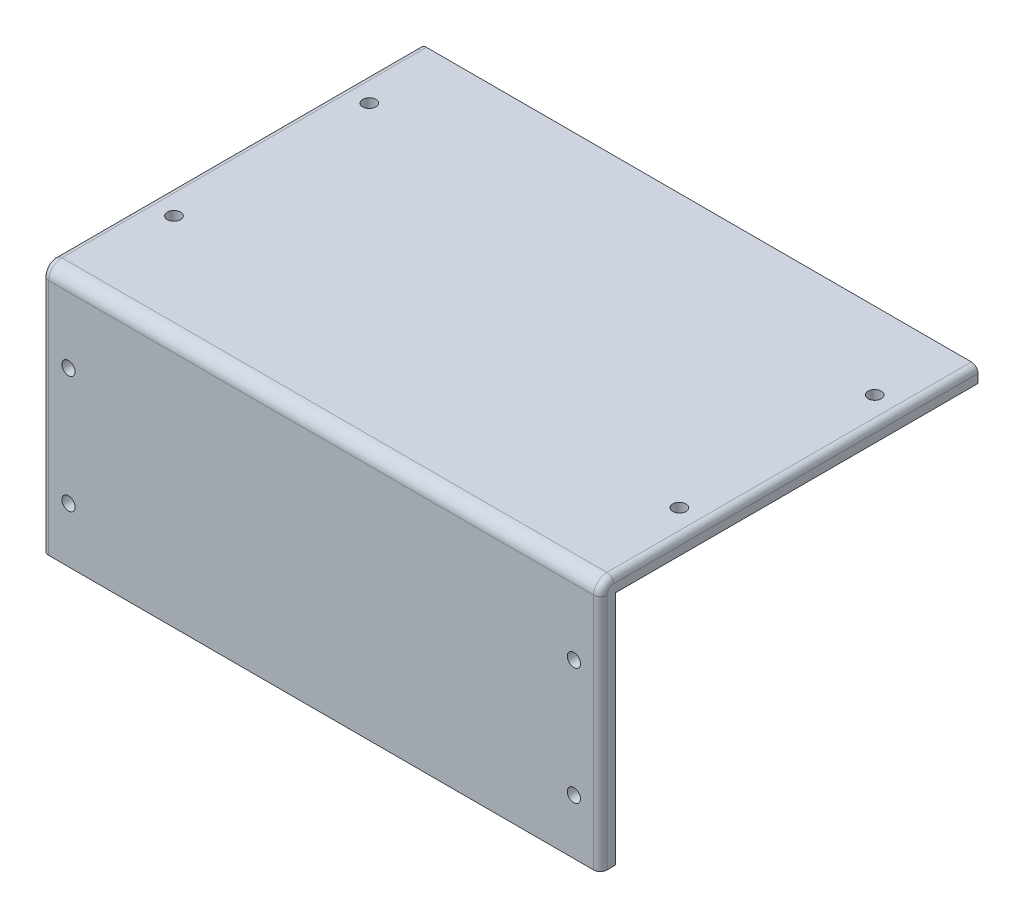
ISO-10303-21;
HEADER;
FILE_DESCRIPTION(('STEP AP214'),'2;1');
FILE_NAME('part.step','',(''),(''),'','','');
FILE_SCHEMA(('AUTOMOTIVE_DESIGN { 1 0 10303 214 1 1 1 1 }'));
ENDSEC;
DATA;
#1=APPLICATION_CONTEXT('core data for automotive mechanical design processes');
#2=APPLICATION_PROTOCOL_DEFINITION('international standard','automotive_design',2000,#1);
#3=PRODUCT_CONTEXT('',#1,'mechanical');
#4=PRODUCT('Part','Part','',(#3));
#5=PRODUCT_RELATED_PRODUCT_CATEGORY('part','',(#4));
#6=PRODUCT_DEFINITION_FORMATION('','',#4);
#7=PRODUCT_DEFINITION_CONTEXT('part definition',#1,'design');
#8=PRODUCT_DEFINITION('design','',#6,#7);
#9=PRODUCT_DEFINITION_SHAPE('','',#8);
#10=(LENGTH_UNIT() NAMED_UNIT(*) SI_UNIT(.MILLI.,.METRE.));
#11=(NAMED_UNIT(*) PLANE_ANGLE_UNIT() SI_UNIT($,.RADIAN.));
#12=(NAMED_UNIT(*) SI_UNIT($,.STERADIAN.) SOLID_ANGLE_UNIT());
#13=UNCERTAINTY_MEASURE_WITH_UNIT(LENGTH_MEASURE(1.E-05),#10,'distance_accuracy_value','');
#14=(GEOMETRIC_REPRESENTATION_CONTEXT(3) GLOBAL_UNCERTAINTY_ASSIGNED_CONTEXT((#13)) GLOBAL_UNIT_ASSIGNED_CONTEXT((#10,
#11,#12)) REPRESENTATION_CONTEXT('',''));
#15=CARTESIAN_POINT('',(0.,0.,0.));
#16=DIRECTION('',(0.,0.,1.));
#17=DIRECTION('',(1.,0.,0.));
#18=AXIS2_PLACEMENT_3D('',#15,#16,#17);
#19=CARTESIAN_POINT('',(0.,0.,3.5));
#20=DIRECTION('',(1.,0.,0.));
#21=DIRECTION('',(0.,0.,-1.));
#22=AXIS2_PLACEMENT_3D('',#19,#20,#21);
#23=PLANE('',#22);
#24=CARTESIAN_POINT('',(0.,54.15,0.5));
#25=DIRECTION('',(1.,0.,0.));
#26=DIRECTION('',(0.,0.,-1.));
#27=AXIS2_PLACEMENT_3D('',#24,#25,#26);
#28=CIRCLE('',#27,1.5);
#29=CARTESIAN_POINT('',(0.,54.15,2.));
#30=VERTEX_POINT('',#29);
#31=CARTESIAN_POINT('',(0.,55.65,0.499999999999979));
#32=VERTEX_POINT('',#31);
#33=EDGE_CURVE('E199',#30,#32,#28,.F.);
#34=ORIENTED_EDGE('',*,*,#33,.T.);
#35=DIRECTION('',(0.,0.,-1.));
#36=VECTOR('',#35,1.);
#37=CARTESIAN_POINT('',(0.,55.65,-82.44));
#38=LINE('',#37,#36);
#39=CARTESIAN_POINT('',(0.,55.65,-82.44));
#40=VERTEX_POINT('',#39);
#41=EDGE_CURVE('E201',#32,#40,#38,.T.);
#42=ORIENTED_EDGE('',*,*,#41,.T.);
#43=DIRECTION('',(0.,-1.,0.));
#44=VECTOR('',#43,1.);
#45=CARTESIAN_POINT('',(0.,57.15,-82.44));
#46=LINE('',#45,#44);
#47=CARTESIAN_POINT('',(0.,53.65,-82.44));
#48=VERTEX_POINT('',#47);
#49=EDGE_CURVE('E365',#40,#48,#46,.T.);
#50=ORIENTED_EDGE('',*,*,#49,.T.);
#51=DIRECTION('',(0.,0.,1.));
#52=VECTOR('',#51,1.);
#53=CARTESIAN_POINT('',(0.,53.65,-82.44));
#54=LINE('',#53,#52);
#55=CARTESIAN_POINT('',(0.,53.65,0.));
#56=VERTEX_POINT('',#55);
#57=EDGE_CURVE('E144',#48,#56,#54,.T.);
#58=ORIENTED_EDGE('',*,*,#57,.T.);
#59=DIRECTION('',(0.,-1.,0.));
#60=VECTOR('',#59,1.);
#61=CARTESIAN_POINT('',(0.,0.,0.));
#62=LINE('',#61,#60);
#63=CARTESIAN_POINT('',(0.,0.,0.));
#64=VERTEX_POINT('',#63);
#65=EDGE_CURVE('E148',#56,#64,#62,.T.);
#66=ORIENTED_EDGE('',*,*,#65,.T.);
#67=DIRECTION('',(0.,0.,-1.));
#68=VECTOR('',#67,1.);
#69=CARTESIAN_POINT('',(0.,0.,3.5));
#70=LINE('',#69,#68);
#71=CARTESIAN_POINT('',(0.,0.,2.));
#72=VERTEX_POINT('',#71);
#73=EDGE_CURVE('E171',#72,#64,#70,.T.);
#74=ORIENTED_EDGE('',*,*,#73,.F.);
#75=DIRECTION('',(0.,-1.,0.));
#76=VECTOR('',#75,1.);
#77=CARTESIAN_POINT('',(0.,0.,2.));
#78=LINE('',#77,#76);
#79=EDGE_CURVE('E190',#72,#30,#78,.F.);
#80=ORIENTED_EDGE('',*,*,#79,.T.);
#81=EDGE_LOOP('',(#34,#42,#50,#58,#66,#74,#80));
#82=FACE_BOUND('',#81,.T.);
#83=ADVANCED_FACE('F38',(#82),#23,.F.);
#84=CARTESIAN_POINT('',(0.,0.,3.5));
#85=DIRECTION('',(0.,1.,0.));
#86=DIRECTION('',(0.,0.,1.));
#87=AXIS2_PLACEMENT_3D('',#84,#85,#86);
#88=PLANE('',#87);
#89=DIRECTION('',(1.,0.,0.));
#90=VECTOR('',#89,1.);
#91=CARTESIAN_POINT('',(0.,0.,3.5));
#92=LINE('',#91,#90);
#93=CARTESIAN_POINT('',(1.5,0.,3.5));
#94=VERTEX_POINT('',#93);
#95=CARTESIAN_POINT('',(125.5,0.,3.5));
#96=VERTEX_POINT('',#95);
#97=EDGE_CURVE('E162',#94,#96,#92,.T.);
#98=ORIENTED_EDGE('',*,*,#97,.F.);
#99=CARTESIAN_POINT('',(1.5,0.,2.));
#100=DIRECTION('',(0.,1.,0.));
#101=DIRECTION('',(0.,0.,1.));
#102=AXIS2_PLACEMENT_3D('',#99,#100,#101);
#103=CIRCLE('',#102,1.5);
#104=EDGE_CURVE('E11',#94,#72,#103,.F.);
#105=ORIENTED_EDGE('',*,*,#104,.T.);
#106=ORIENTED_EDGE('',*,*,#73,.T.);
#107=DIRECTION('',(1.,0.,0.));
#108=VECTOR('',#107,1.);
#109=CARTESIAN_POINT('',(0.,0.,0.));
#110=LINE('',#109,#108);
#111=CARTESIAN_POINT('',(127.,0.,0.));
#112=VERTEX_POINT('',#111);
#113=EDGE_CURVE('E152',#64,#112,#110,.T.);
#114=ORIENTED_EDGE('',*,*,#113,.T.);
#115=DIRECTION('',(0.,0.,-1.));
#116=VECTOR('',#115,1.);
#117=CARTESIAN_POINT('',(127.,0.,3.5));
#118=LINE('',#117,#116);
#119=CARTESIAN_POINT('',(127.,0.,2.));
#120=VERTEX_POINT('',#119);
#121=EDGE_CURVE('E163',#120,#112,#118,.T.);
#122=ORIENTED_EDGE('',*,*,#121,.F.);
#123=CARTESIAN_POINT('',(125.5,0.,2.));
#124=DIRECTION('',(0.,1.,0.));
#125=DIRECTION('',(0.,0.,1.));
#126=AXIS2_PLACEMENT_3D('',#123,#124,#125);
#127=CIRCLE('',#126,1.5);
#128=EDGE_CURVE('E187',#120,#96,#127,.F.);
#129=ORIENTED_EDGE('',*,*,#128,.T.);
#130=EDGE_LOOP('',(#98,#105,#106,#114,#122,#129));
#131=FACE_BOUND('',#130,.T.);
#132=ADVANCED_FACE('F225',(#131),#88,.F.);
#133=CARTESIAN_POINT('',(127.,0.,3.5));
#134=DIRECTION('',(-1.,0.,0.));
#135=DIRECTION('',(0.,0.,1.));
#136=AXIS2_PLACEMENT_3D('',#133,#134,#135);
#137=PLANE('',#136);
#138=DIRECTION('',(0.,-1.,0.));
#139=VECTOR('',#138,1.);
#140=CARTESIAN_POINT('',(127.,57.15,-82.44));
#141=LINE('',#140,#139);
#142=CARTESIAN_POINT('',(127.,55.65,-82.44));
#143=VERTEX_POINT('',#142);
#144=CARTESIAN_POINT('',(127.,53.65,-82.44));
#145=VERTEX_POINT('',#144);
#146=EDGE_CURVE('E123',#143,#145,#141,.T.);
#147=ORIENTED_EDGE('',*,*,#146,.F.);
#148=DIRECTION('',(0.,0.,-1.));
#149=VECTOR('',#148,1.);
#150=CARTESIAN_POINT('',(127.,55.65,0.499999999999979));
#151=LINE('',#150,#149);
#152=CARTESIAN_POINT('',(127.,55.65,0.499999999999979));
#153=VERTEX_POINT('',#152);
#154=EDGE_CURVE('E181',#143,#153,#151,.F.);
#155=ORIENTED_EDGE('',*,*,#154,.T.);
#156=CARTESIAN_POINT('',(127.,54.15,0.5));
#157=DIRECTION('',(-1.,0.,0.));
#158=DIRECTION('',(0.,0.,1.));
#159=AXIS2_PLACEMENT_3D('',#156,#157,#158);
#160=CIRCLE('',#159,1.5);
#161=CARTESIAN_POINT('',(127.,54.15,2.));
#162=VERTEX_POINT('',#161);
#163=EDGE_CURVE('E179',#153,#162,#160,.F.);
#164=ORIENTED_EDGE('',*,*,#163,.T.);
#165=DIRECTION('',(0.,1.,0.));
#166=VECTOR('',#165,1.);
#167=CARTESIAN_POINT('',(127.,0.,2.));
#168=LINE('',#167,#166);
#169=EDGE_CURVE('E177',#162,#120,#168,.F.);
#170=ORIENTED_EDGE('',*,*,#169,.T.);
#171=ORIENTED_EDGE('',*,*,#121,.T.);
#172=DIRECTION('',(0.,1.,0.));
#173=VECTOR('',#172,1.);
#174=CARTESIAN_POINT('',(127.,0.,0.));
#175=LINE('',#174,#173);
#176=CARTESIAN_POINT('',(127.,53.65,0.));
#177=VERTEX_POINT('',#176);
#178=EDGE_CURVE('E140',#112,#177,#175,.T.);
#179=ORIENTED_EDGE('',*,*,#178,.T.);
#180=DIRECTION('',(0.,0.,1.));
#181=VECTOR('',#180,1.);
#182=CARTESIAN_POINT('',(127.,53.65,0.));
#183=LINE('',#182,#181);
#184=EDGE_CURVE('E135',#145,#177,#183,.T.);
#185=ORIENTED_EDGE('',*,*,#184,.F.);
#186=EDGE_LOOP('',(#147,#155,#164,#170,#171,#179,#185));
#187=FACE_BOUND('',#186,.T.);
#188=ADVANCED_FACE('F138',(#187),#137,.F.);
#189=CARTESIAN_POINT('',(0.,0.,3.5));
#190=DIRECTION('',(0.,0.,-1.));
#191=DIRECTION('',(-1.,0.,0.));
#192=AXIS2_PLACEMENT_3D('',#189,#190,#191);
#193=PLANE('',#192);
#194=CARTESIAN_POINT('',(6.00000000000001,39.15,3.5));
#195=DIRECTION('',(0.,0.,-1.));
#196=DIRECTION('',(1.,0.,0.));
#197=AXIS2_PLACEMENT_3D('',#194,#195,#196);
#198=CIRCLE('',#197,1.5);
#199=CARTESIAN_POINT('',(7.5,39.15,3.5));
#200=VERTEX_POINT('',#199);
#201=EDGE_CURVE('E357',#200,#200,#198,.T.);
#202=ORIENTED_EDGE('',*,*,#201,.T.);
#203=EDGE_LOOP('',(#202));
#204=FACE_BOUND('',#203,.T.);
#205=CARTESIAN_POINT('',(6.00000000000001,12.5,3.5));
#206=DIRECTION('',(0.,0.,-1.));
#207=DIRECTION('',(1.,0.,0.));
#208=AXIS2_PLACEMENT_3D('',#205,#206,#207);
#209=CIRCLE('',#208,1.5);
#210=CARTESIAN_POINT('',(7.5,12.5,3.5));
#211=VERTEX_POINT('',#210);
#212=EDGE_CURVE('E351',#211,#211,#209,.T.);
#213=ORIENTED_EDGE('',*,*,#212,.T.);
#214=EDGE_LOOP('',(#213));
#215=FACE_BOUND('',#214,.T.);
#216=CARTESIAN_POINT('',(121.,12.5,3.5));
#217=DIRECTION('',(0.,0.,-1.));
#218=DIRECTION('',(-1.,0.,0.));
#219=AXIS2_PLACEMENT_3D('',#216,#217,#218);
#220=CIRCLE('',#219,1.5);
#221=CARTESIAN_POINT('',(119.5,12.5,3.5));
#222=VERTEX_POINT('',#221);
#223=EDGE_CURVE('E344',#222,#222,#220,.T.);
#224=ORIENTED_EDGE('',*,*,#223,.T.);
#225=EDGE_LOOP('',(#224));
#226=FACE_BOUND('',#225,.T.);
#227=CARTESIAN_POINT('',(121.,39.15,3.5));
#228=DIRECTION('',(0.,0.,-1.));
#229=DIRECTION('',(-1.,0.,0.));
#230=AXIS2_PLACEMENT_3D('',#227,#228,#229);
#231=CIRCLE('',#230,1.5);
#232=CARTESIAN_POINT('',(119.5,39.15,3.5));
#233=VERTEX_POINT('',#232);
#234=EDGE_CURVE('E362',#233,#233,#231,.T.);
#235=ORIENTED_EDGE('',*,*,#234,.T.);
#236=EDGE_LOOP('',(#235));
#237=FACE_BOUND('',#236,.T.);
#238=DIRECTION('',(-1.,0.,0.));
#239=VECTOR('',#238,1.);
#240=CARTESIAN_POINT('',(127.,54.15,3.5));
#241=LINE('',#240,#239);
#242=CARTESIAN_POINT('',(125.5,54.15,3.5));
#243=VERTEX_POINT('',#242);
#244=CARTESIAN_POINT('',(1.5,54.15,3.5));
#245=VERTEX_POINT('',#244);
#246=EDGE_CURVE('E134',#243,#245,#241,.T.);
#247=ORIENTED_EDGE('',*,*,#246,.T.);
#248=DIRECTION('',(0.,-1.,0.));
#249=VECTOR('',#248,1.);
#250=CARTESIAN_POINT('',(1.5,0.,3.5));
#251=LINE('',#250,#249);
#252=EDGE_CURVE('E47',#245,#94,#251,.T.);
#253=ORIENTED_EDGE('',*,*,#252,.T.);
#254=ORIENTED_EDGE('',*,*,#97,.T.);
#255=DIRECTION('',(0.,1.,0.));
#256=VECTOR('',#255,1.);
#257=CARTESIAN_POINT('',(125.5,0.,3.5));
#258=LINE('',#257,#256);
#259=EDGE_CURVE('E185',#96,#243,#258,.T.);
#260=ORIENTED_EDGE('',*,*,#259,.T.);
#261=EDGE_LOOP('',(#247,#253,#254,#260));
#262=FACE_BOUND('',#261,.T.);
#263=ADVANCED_FACE('F238',(#204,#215,#226,#237,#262),#193,.F.);
#264=CARTESIAN_POINT('',(0.,0.,0.));
#265=DIRECTION('',(0.,0.,-1.));
#266=DIRECTION('',(-1.,0.,0.));
#267=AXIS2_PLACEMENT_3D('',#264,#265,#266);
#268=PLANE('',#267);
#269=CARTESIAN_POINT('',(6.00000000000001,39.15,0.));
#270=DIRECTION('',(0.,0.,-1.));
#271=DIRECTION('',(1.,0.,0.));
#272=AXIS2_PLACEMENT_3D('',#269,#270,#271);
#273=CIRCLE('',#272,1.5);
#274=CARTESIAN_POINT('',(7.5,39.15,0.));
#275=VERTEX_POINT('',#274);
#276=EDGE_CURVE('E341',#275,#275,#273,.T.);
#277=ORIENTED_EDGE('',*,*,#276,.F.);
#278=EDGE_LOOP('',(#277));
#279=FACE_BOUND('',#278,.T.);
#280=CARTESIAN_POINT('',(6.00000000000001,12.5,0.));
#281=DIRECTION('',(0.,0.,-1.));
#282=DIRECTION('',(1.,0.,0.));
#283=AXIS2_PLACEMENT_3D('',#280,#281,#282);
#284=CIRCLE('',#283,1.5);
#285=CARTESIAN_POINT('',(7.5,12.5,0.));
#286=VERTEX_POINT('',#285);
#287=EDGE_CURVE('E354',#286,#286,#284,.T.);
#288=ORIENTED_EDGE('',*,*,#287,.F.);
#289=EDGE_LOOP('',(#288));
#290=FACE_BOUND('',#289,.T.);
#291=CARTESIAN_POINT('',(121.,12.5,0.));
#292=DIRECTION('',(0.,0.,-1.));
#293=DIRECTION('',(-1.,0.,0.));
#294=AXIS2_PLACEMENT_3D('',#291,#292,#293);
#295=CIRCLE('',#294,1.5);
#296=CARTESIAN_POINT('',(119.5,12.5,0.));
#297=VERTEX_POINT('',#296);
#298=EDGE_CURVE('E348',#297,#297,#295,.T.);
#299=ORIENTED_EDGE('',*,*,#298,.F.);
#300=EDGE_LOOP('',(#299));
#301=FACE_BOUND('',#300,.T.);
#302=CARTESIAN_POINT('',(121.,39.15,0.));
#303=DIRECTION('',(0.,0.,-1.));
#304=DIRECTION('',(-1.,0.,0.));
#305=AXIS2_PLACEMENT_3D('',#302,#303,#304);
#306=CIRCLE('',#305,1.5);
#307=CARTESIAN_POINT('',(119.5,39.15,0.));
#308=VERTEX_POINT('',#307);
#309=EDGE_CURVE('E347',#308,#308,#306,.T.);
#310=ORIENTED_EDGE('',*,*,#309,.F.);
#311=EDGE_LOOP('',(#310));
#312=FACE_BOUND('',#311,.T.);
#313=ORIENTED_EDGE('',*,*,#65,.F.);
#314=DIRECTION('',(-1.,0.,0.));
#315=VECTOR('',#314,1.);
#316=CARTESIAN_POINT('',(0.,53.65,0.));
#317=LINE('',#316,#315);
#318=EDGE_CURVE('E164',#177,#56,#317,.T.);
#319=ORIENTED_EDGE('',*,*,#318,.F.);
#320=ORIENTED_EDGE('',*,*,#178,.F.);
#321=ORIENTED_EDGE('',*,*,#113,.F.);
#322=EDGE_LOOP('',(#313,#319,#320,#321));
#323=FACE_BOUND('',#322,.T.);
#324=ADVANCED_FACE('F229',(#279,#290,#301,#312,#323),#268,.T.);
#325=CARTESIAN_POINT('',(127.,53.65,-82.44));
#326=DIRECTION('',(0.,-1.,0.));
#327=DIRECTION('',(0.,0.,-1.));
#328=AXIS2_PLACEMENT_3D('',#325,#326,#327);
#329=PLANE('',#328);
#330=CARTESIAN_POINT('',(121.,53.65,-20.5));
#331=DIRECTION('',(0.,-1.,0.));
#332=DIRECTION('',(0.,0.,1.));
#333=AXIS2_PLACEMENT_3D('',#330,#331,#332);
#334=CIRCLE('',#333,1.50000000000001);
#335=CARTESIAN_POINT('',(121.,53.65,-19.));
#336=VERTEX_POINT('',#335);
#337=EDGE_CURVE('E197',#336,#336,#334,.T.);
#338=ORIENTED_EDGE('',*,*,#337,.F.);
#339=EDGE_LOOP('',(#338));
#340=FACE_BOUND('',#339,.T.);
#341=CARTESIAN_POINT('',(121.,53.65,-64.94));
#342=DIRECTION('',(0.,-1.,0.));
#343=DIRECTION('',(0.,0.,1.));
#344=AXIS2_PLACEMENT_3D('',#341,#342,#343);
#345=CIRCLE('',#344,1.50000000000001);
#346=CARTESIAN_POINT('',(121.,53.65,-63.44));
#347=VERTEX_POINT('',#346);
#348=EDGE_CURVE('E328',#347,#347,#345,.T.);
#349=ORIENTED_EDGE('',*,*,#348,.F.);
#350=EDGE_LOOP('',(#349));
#351=FACE_BOUND('',#350,.T.);
#352=CARTESIAN_POINT('',(6.00000000000001,53.65,-64.94));
#353=DIRECTION('',(0.,-1.,0.));
#354=DIRECTION('',(0.,0.,-1.));
#355=AXIS2_PLACEMENT_3D('',#352,#353,#354);
#356=CIRCLE('',#355,1.5);
#357=CARTESIAN_POINT('',(6.00000000000001,53.65,-66.44));
#358=VERTEX_POINT('',#357);
#359=EDGE_CURVE('E321',#358,#358,#356,.T.);
#360=ORIENTED_EDGE('',*,*,#359,.F.);
#361=EDGE_LOOP('',(#360));
#362=FACE_BOUND('',#361,.T.);
#363=CARTESIAN_POINT('',(6.,53.65,-20.5));
#364=DIRECTION('',(0.,-1.,0.));
#365=DIRECTION('',(0.,0.,-1.));
#366=AXIS2_PLACEMENT_3D('',#363,#364,#365);
#367=CIRCLE('',#366,1.5);
#368=CARTESIAN_POINT('',(6.,53.65,-22.));
#369=VERTEX_POINT('',#368);
#370=EDGE_CURVE('E325',#369,#369,#367,.T.);
#371=ORIENTED_EDGE('',*,*,#370,.F.);
#372=EDGE_LOOP('',(#371));
#373=FACE_BOUND('',#372,.T.);
#374=ORIENTED_EDGE('',*,*,#184,.T.);
#375=ORIENTED_EDGE('',*,*,#318,.T.);
#376=ORIENTED_EDGE('',*,*,#57,.F.);
#377=DIRECTION('',(-1.,0.,0.));
#378=VECTOR('',#377,1.);
#379=CARTESIAN_POINT('',(127.,53.65,-82.44));
#380=LINE('',#379,#378);
#381=EDGE_CURVE('E128',#145,#48,#380,.T.);
#382=ORIENTED_EDGE('',*,*,#381,.F.);
#383=EDGE_LOOP('',(#374,#375,#376,#382));
#384=FACE_BOUND('',#383,.T.);
#385=ADVANCED_FACE('F146',(#340,#351,#362,#373,#384),#329,.T.);
#386=CARTESIAN_POINT('',(127.,57.15,-82.44));
#387=DIRECTION('',(0.,0.,-1.));
#388=DIRECTION('',(0.,1.,0.));
#389=AXIS2_PLACEMENT_3D('',#386,#387,#388);
#390=PLANE('',#389);
#391=ORIENTED_EDGE('',*,*,#49,.F.);
#392=CARTESIAN_POINT('',(1.5,55.65,-82.44));
#393=DIRECTION('',(0.,0.,-1.));
#394=DIRECTION('',(0.,1.,0.));
#395=AXIS2_PLACEMENT_3D('',#392,#393,#394);
#396=CIRCLE('',#395,1.5);
#397=CARTESIAN_POINT('',(1.5,57.15,-82.44));
#398=VERTEX_POINT('',#397);
#399=EDGE_CURVE('E204',#40,#398,#396,.T.);
#400=ORIENTED_EDGE('',*,*,#399,.T.);
#401=DIRECTION('',(-1.,0.,0.));
#402=VECTOR('',#401,1.);
#403=CARTESIAN_POINT('',(127.,57.15,-82.44));
#404=LINE('',#403,#402);
#405=CARTESIAN_POINT('',(125.5,57.15,-82.44));
#406=VERTEX_POINT('',#405);
#407=EDGE_CURVE('E149',#406,#398,#404,.T.);
#408=ORIENTED_EDGE('',*,*,#407,.F.);
#409=CARTESIAN_POINT('',(125.5,55.65,-82.44));
#410=DIRECTION('',(0.,0.,-1.));
#411=DIRECTION('',(0.,1.,0.));
#412=AXIS2_PLACEMENT_3D('',#409,#410,#411);
#413=CIRCLE('',#412,1.5);
#414=EDGE_CURVE('E131',#406,#143,#413,.T.);
#415=ORIENTED_EDGE('',*,*,#414,.T.);
#416=ORIENTED_EDGE('',*,*,#146,.T.);
#417=ORIENTED_EDGE('',*,*,#381,.T.);
#418=EDGE_LOOP('',(#391,#400,#408,#415,#416,#417));
#419=FACE_BOUND('',#418,.T.);
#420=ADVANCED_FACE('F126',(#419),#390,.T.);
#421=CARTESIAN_POINT('',(127.,57.15,0.499999999999979));
#422=DIRECTION('',(0.,1.,0.));
#423=DIRECTION('',(0.,0.,1.));
#424=AXIS2_PLACEMENT_3D('',#421,#422,#423);
#425=PLANE('',#424);
#426=CARTESIAN_POINT('',(121.,57.15,-20.5));
#427=DIRECTION('',(0.,-1.,0.));
#428=DIRECTION('',(0.,0.,1.));
#429=AXIS2_PLACEMENT_3D('',#426,#427,#428);
#430=CIRCLE('',#429,1.50000000000001);
#431=CARTESIAN_POINT('',(121.,57.15,-19.));
#432=VERTEX_POINT('',#431);
#433=EDGE_CURVE('E333',#432,#432,#430,.T.);
#434=ORIENTED_EDGE('',*,*,#433,.T.);
#435=EDGE_LOOP('',(#434));
#436=FACE_BOUND('',#435,.T.);
#437=CARTESIAN_POINT('',(121.,57.15,-64.94));
#438=DIRECTION('',(0.,-1.,0.));
#439=DIRECTION('',(0.,0.,1.));
#440=AXIS2_PLACEMENT_3D('',#437,#438,#439);
#441=CIRCLE('',#440,1.50000000000001);
#442=CARTESIAN_POINT('',(121.,57.15,-63.44));
#443=VERTEX_POINT('',#442);
#444=EDGE_CURVE('E323',#443,#443,#441,.T.);
#445=ORIENTED_EDGE('',*,*,#444,.T.);
#446=EDGE_LOOP('',(#445));
#447=FACE_BOUND('',#446,.T.);
#448=CARTESIAN_POINT('',(6.00000000000001,57.15,-64.94));
#449=DIRECTION('',(0.,-1.,0.));
#450=DIRECTION('',(0.,0.,-1.));
#451=AXIS2_PLACEMENT_3D('',#448,#449,#450);
#452=CIRCLE('',#451,1.5);
#453=CARTESIAN_POINT('',(6.00000000000001,57.15,-66.44));
#454=VERTEX_POINT('',#453);
#455=EDGE_CURVE('E318',#454,#454,#452,.T.);
#456=ORIENTED_EDGE('',*,*,#455,.T.);
#457=EDGE_LOOP('',(#456));
#458=FACE_BOUND('',#457,.T.);
#459=CARTESIAN_POINT('',(6.,57.15,-20.5));
#460=DIRECTION('',(0.,-1.,0.));
#461=DIRECTION('',(0.,0.,-1.));
#462=AXIS2_PLACEMENT_3D('',#459,#460,#461);
#463=CIRCLE('',#462,1.5);
#464=CARTESIAN_POINT('',(6.,57.15,-22.));
#465=VERTEX_POINT('',#464);
#466=EDGE_CURVE('E338',#465,#465,#463,.T.);
#467=ORIENTED_EDGE('',*,*,#466,.T.);
#468=EDGE_LOOP('',(#467));
#469=FACE_BOUND('',#468,.T.);
#470=ORIENTED_EDGE('',*,*,#407,.T.);
#471=DIRECTION('',(0.,0.,-1.));
#472=VECTOR('',#471,1.);
#473=CARTESIAN_POINT('',(1.5,57.15,0.499999999999979));
#474=LINE('',#473,#472);
#475=CARTESIAN_POINT('',(1.5,57.15,0.499999999999979));
#476=VERTEX_POINT('',#475);
#477=EDGE_CURVE('E206',#398,#476,#474,.F.);
#478=ORIENTED_EDGE('',*,*,#477,.T.);
#479=DIRECTION('',(-1.,0.,0.));
#480=VECTOR('',#479,1.);
#481=CARTESIAN_POINT('',(127.,57.15,0.499999999999979));
#482=LINE('',#481,#480);
#483=CARTESIAN_POINT('',(125.5,57.15,0.499999999999979));
#484=VERTEX_POINT('',#483);
#485=EDGE_CURVE('E155',#484,#476,#482,.T.);
#486=ORIENTED_EDGE('',*,*,#485,.F.);
#487=DIRECTION('',(0.,0.,-1.));
#488=VECTOR('',#487,1.);
#489=CARTESIAN_POINT('',(125.5,57.15,-82.44));
#490=LINE('',#489,#488);
#491=EDGE_CURVE('E173',#484,#406,#490,.T.);
#492=ORIENTED_EDGE('',*,*,#491,.T.);
#493=EDGE_LOOP('',(#470,#478,#486,#492));
#494=FACE_BOUND('',#493,.T.);
#495=ADVANCED_FACE('F244',(#436,#447,#458,#469,#494),#425,.T.);
#496=CARTESIAN_POINT('',(127.,54.15,0.5));
#497=DIRECTION('',(-1.,0.,0.));
#498=DIRECTION('',(0.,0.,1.));
#499=AXIS2_PLACEMENT_3D('',#496,#497,#498);
#500=CYLINDRICAL_SURFACE('',#499,3.);
#501=ORIENTED_EDGE('',*,*,#485,.T.);
#502=CARTESIAN_POINT('',(1.5,54.15,0.5));
#503=DIRECTION('',(1.,0.,0.));
#504=DIRECTION('',(0.,0.,-1.));
#505=AXIS2_PLACEMENT_3D('',#502,#503,#504);
#506=CIRCLE('',#505,3.);
#507=EDGE_CURVE('E62',#476,#245,#506,.T.);
#508=ORIENTED_EDGE('',*,*,#507,.T.);
#509=ORIENTED_EDGE('',*,*,#246,.F.);
#510=CARTESIAN_POINT('',(125.5,54.15,0.5));
#511=DIRECTION('',(-1.,0.,0.));
#512=DIRECTION('',(0.,0.,1.));
#513=AXIS2_PLACEMENT_3D('',#510,#511,#512);
#514=CIRCLE('',#513,3.);
#515=EDGE_CURVE('E183',#243,#484,#514,.T.);
#516=ORIENTED_EDGE('',*,*,#515,.T.);
#517=EDGE_LOOP('',(#501,#508,#509,#516));
#518=FACE_BOUND('',#517,.T.);
#519=ADVANCED_FACE('F239',(#518),#500,.T.);
#520=CARTESIAN_POINT('',(121.,39.15,3.5));
#521=DIRECTION('',(0.,0.,-1.));
#522=DIRECTION('',(-1.,0.,0.));
#523=AXIS2_PLACEMENT_3D('',#520,#521,#522);
#524=CYLINDRICAL_SURFACE('',#523,1.5);
#525=ORIENTED_EDGE('',*,*,#234,.F.);
#526=EDGE_LOOP('',(#525));
#527=FACE_BOUND('',#526,.T.);
#528=ORIENTED_EDGE('',*,*,#309,.T.);
#529=EDGE_LOOP('',(#528));
#530=FACE_BOUND('',#529,.T.);
#531=ADVANCED_FACE('F274',(#527,#530),#524,.F.);
#532=CARTESIAN_POINT('',(121.,12.5,3.5));
#533=DIRECTION('',(0.,0.,-1.));
#534=DIRECTION('',(-1.,0.,0.));
#535=AXIS2_PLACEMENT_3D('',#532,#533,#534);
#536=CYLINDRICAL_SURFACE('',#535,1.5);
#537=ORIENTED_EDGE('',*,*,#223,.F.);
#538=EDGE_LOOP('',(#537));
#539=FACE_BOUND('',#538,.T.);
#540=ORIENTED_EDGE('',*,*,#298,.T.);
#541=EDGE_LOOP('',(#540));
#542=FACE_BOUND('',#541,.T.);
#543=ADVANCED_FACE('F285',(#539,#542),#536,.F.);
#544=CARTESIAN_POINT('',(6.00000000000001,12.5,3.5));
#545=DIRECTION('',(0.,0.,-1.));
#546=DIRECTION('',(-1.,0.,0.));
#547=AXIS2_PLACEMENT_3D('',#544,#545,#546);
#548=CYLINDRICAL_SURFACE('',#547,1.5);
#549=ORIENTED_EDGE('',*,*,#212,.F.);
#550=EDGE_LOOP('',(#549));
#551=FACE_BOUND('',#550,.T.);
#552=ORIENTED_EDGE('',*,*,#287,.T.);
#553=EDGE_LOOP('',(#552));
#554=FACE_BOUND('',#553,.T.);
#555=ADVANCED_FACE('F291',(#551,#554),#548,.F.);
#556=CARTESIAN_POINT('',(6.00000000000001,39.15,3.5));
#557=DIRECTION('',(0.,0.,-1.));
#558=DIRECTION('',(-1.,0.,0.));
#559=AXIS2_PLACEMENT_3D('',#556,#557,#558);
#560=CYLINDRICAL_SURFACE('',#559,1.5);
#561=ORIENTED_EDGE('',*,*,#201,.F.);
#562=EDGE_LOOP('',(#561));
#563=FACE_BOUND('',#562,.T.);
#564=ORIENTED_EDGE('',*,*,#276,.T.);
#565=EDGE_LOOP('',(#564));
#566=FACE_BOUND('',#565,.T.);
#567=ADVANCED_FACE('F287',(#563,#566),#560,.F.);
#568=CARTESIAN_POINT('',(6.,57.15,-20.5));
#569=DIRECTION('',(0.,-1.,0.));
#570=DIRECTION('',(0.,0.,-1.));
#571=AXIS2_PLACEMENT_3D('',#568,#569,#570);
#572=CYLINDRICAL_SURFACE('',#571,1.5);
#573=ORIENTED_EDGE('',*,*,#466,.F.);
#574=EDGE_LOOP('',(#573));
#575=FACE_BOUND('',#574,.T.);
#576=ORIENTED_EDGE('',*,*,#370,.T.);
#577=EDGE_LOOP('',(#576));
#578=FACE_BOUND('',#577,.T.);
#579=ADVANCED_FACE('F290',(#575,#578),#572,.F.);
#580=CARTESIAN_POINT('',(6.00000000000001,57.15,-64.94));
#581=DIRECTION('',(0.,-1.,0.));
#582=DIRECTION('',(0.,0.,-1.));
#583=AXIS2_PLACEMENT_3D('',#580,#581,#582);
#584=CYLINDRICAL_SURFACE('',#583,1.5);
#585=ORIENTED_EDGE('',*,*,#455,.F.);
#586=EDGE_LOOP('',(#585));
#587=FACE_BOUND('',#586,.T.);
#588=ORIENTED_EDGE('',*,*,#359,.T.);
#589=EDGE_LOOP('',(#588));
#590=FACE_BOUND('',#589,.T.);
#591=ADVANCED_FACE('F301',(#587,#590),#584,.F.);
#592=CARTESIAN_POINT('',(121.,57.15,-64.94));
#593=DIRECTION('',(0.,-1.,0.));
#594=DIRECTION('',(0.,0.,-1.));
#595=AXIS2_PLACEMENT_3D('',#592,#593,#594);
#596=CYLINDRICAL_SURFACE('',#595,1.50000000000001);
#597=ORIENTED_EDGE('',*,*,#444,.F.);
#598=EDGE_LOOP('',(#597));
#599=FACE_BOUND('',#598,.T.);
#600=ORIENTED_EDGE('',*,*,#348,.T.);
#601=EDGE_LOOP('',(#600));
#602=FACE_BOUND('',#601,.T.);
#603=ADVANCED_FACE('F306',(#599,#602),#596,.F.);
#604=CARTESIAN_POINT('',(121.,57.15,-20.5));
#605=DIRECTION('',(0.,-1.,0.));
#606=DIRECTION('',(0.,0.,-1.));
#607=AXIS2_PLACEMENT_3D('',#604,#605,#606);
#608=CYLINDRICAL_SURFACE('',#607,1.50000000000001);
#609=ORIENTED_EDGE('',*,*,#433,.F.);
#610=EDGE_LOOP('',(#609));
#611=FACE_BOUND('',#610,.T.);
#612=ORIENTED_EDGE('',*,*,#337,.T.);
#613=EDGE_LOOP('',(#612));
#614=FACE_BOUND('',#613,.T.);
#615=ADVANCED_FACE('F303',(#611,#614),#608,.F.);
#616=CARTESIAN_POINT('',(125.5,0.,2.));
#617=DIRECTION('',(0.,1.,0.));
#618=DIRECTION('',(0.,0.,1.));
#619=AXIS2_PLACEMENT_3D('',#616,#617,#618);
#620=CYLINDRICAL_SURFACE('',#619,1.5);
#621=ORIENTED_EDGE('',*,*,#128,.F.);
#622=ORIENTED_EDGE('',*,*,#169,.F.);
#623=CARTESIAN_POINT('',(125.5,54.15,2.));
#624=DIRECTION('',(0.,1.,0.));
#625=DIRECTION('',(-1.,0.,0.));
#626=AXIS2_PLACEMENT_3D('',#623,#624,#625);
#627=CIRCLE('',#626,1.5);
#628=EDGE_CURVE('E194',#243,#162,#627,.T.);
#629=ORIENTED_EDGE('',*,*,#628,.F.);
#630=ORIENTED_EDGE('',*,*,#259,.F.);
#631=EDGE_LOOP('',(#621,#622,#629,#630));
#632=FACE_BOUND('',#631,.T.);
#633=ADVANCED_FACE('F235',(#632),#620,.T.);
#634=CARTESIAN_POINT('',(125.5,54.15,0.5));
#635=DIRECTION('',(-1.,0.,0.));
#636=DIRECTION('',(0.,0.,1.));
#637=AXIS2_PLACEMENT_3D('',#634,#635,#636);
#638=TOROIDAL_SURFACE('',#637,1.5,1.5);
#639=ORIENTED_EDGE('',*,*,#628,.T.);
#640=ORIENTED_EDGE('',*,*,#163,.F.);
#641=CARTESIAN_POINT('',(125.5,55.65,0.49999999999999));
#642=DIRECTION('',(0.,0.,-1.));
#643=DIRECTION('',(0.,1.,0.));
#644=AXIS2_PLACEMENT_3D('',#641,#642,#643);
#645=CIRCLE('',#644,1.5);
#646=EDGE_CURVE('E191',#484,#153,#645,.T.);
#647=ORIENTED_EDGE('',*,*,#646,.F.);
#648=ORIENTED_EDGE('',*,*,#515,.F.);
#649=EDGE_LOOP('',(#639,#640,#647,#648));
#650=FACE_BOUND('',#649,.T.);
#651=ADVANCED_FACE('F247',(#650),#638,.T.);
#652=CARTESIAN_POINT('',(125.5,55.65,0.499999999999979));
#653=DIRECTION('',(0.,0.,1.));
#654=DIRECTION('',(0.,-1.,0.));
#655=AXIS2_PLACEMENT_3D('',#652,#653,#654);
#656=CYLINDRICAL_SURFACE('',#655,1.5);
#657=ORIENTED_EDGE('',*,*,#646,.T.);
#658=ORIENTED_EDGE('',*,*,#154,.F.);
#659=ORIENTED_EDGE('',*,*,#414,.F.);
#660=ORIENTED_EDGE('',*,*,#491,.F.);
#661=EDGE_LOOP('',(#657,#658,#659,#660));
#662=FACE_BOUND('',#661,.T.);
#663=ADVANCED_FACE('F249',(#662),#656,.T.);
#664=CARTESIAN_POINT('',(1.5,0.,2.));
#665=DIRECTION('',(0.,-1.,0.));
#666=DIRECTION('',(0.,0.,-1.));
#667=AXIS2_PLACEMENT_3D('',#664,#665,#666);
#668=CYLINDRICAL_SURFACE('',#667,1.5);
#669=ORIENTED_EDGE('',*,*,#104,.F.);
#670=ORIENTED_EDGE('',*,*,#252,.F.);
#671=CARTESIAN_POINT('',(1.5,54.15,2.));
#672=DIRECTION('',(0.,1.,0.));
#673=DIRECTION('',(0.,0.,1.));
#674=AXIS2_PLACEMENT_3D('',#671,#672,#673);
#675=CIRCLE('',#674,1.5);
#676=EDGE_CURVE('E42',#30,#245,#675,.T.);
#677=ORIENTED_EDGE('',*,*,#676,.F.);
#678=ORIENTED_EDGE('',*,*,#79,.F.);
#679=EDGE_LOOP('',(#669,#670,#677,#678));
#680=FACE_BOUND('',#679,.T.);
#681=ADVANCED_FACE('F40',(#680),#668,.T.);
#682=CARTESIAN_POINT('',(1.5,54.15,0.5));
#683=DIRECTION('',(1.,0.,0.));
#684=DIRECTION('',(0.,0.,-1.));
#685=AXIS2_PLACEMENT_3D('',#682,#683,#684);
#686=TOROIDAL_SURFACE('',#685,1.5,1.5);
#687=ORIENTED_EDGE('',*,*,#676,.T.);
#688=ORIENTED_EDGE('',*,*,#507,.F.);
#689=CARTESIAN_POINT('',(1.5,55.65,0.499999999999979));
#690=DIRECTION('',(0.,0.,-1.));
#691=DIRECTION('',(0.,1.,0.));
#692=AXIS2_PLACEMENT_3D('',#689,#690,#691);
#693=CIRCLE('',#692,1.5);
#694=EDGE_CURVE('E209',#32,#476,#693,.T.);
#695=ORIENTED_EDGE('',*,*,#694,.F.);
#696=ORIENTED_EDGE('',*,*,#33,.F.);
#697=EDGE_LOOP('',(#687,#688,#695,#696));
#698=FACE_BOUND('',#697,.T.);
#699=ADVANCED_FACE('F219',(#698),#686,.T.);
#700=CARTESIAN_POINT('',(1.5,55.65,3.5));
#701=DIRECTION('',(0.,0.,1.));
#702=DIRECTION('',(0.,-1.,0.));
#703=AXIS2_PLACEMENT_3D('',#700,#701,#702);
#704=CYLINDRICAL_SURFACE('',#703,1.5);
#705=ORIENTED_EDGE('',*,*,#694,.T.);
#706=ORIENTED_EDGE('',*,*,#477,.F.);
#707=ORIENTED_EDGE('',*,*,#399,.F.);
#708=ORIENTED_EDGE('',*,*,#41,.F.);
#709=EDGE_LOOP('',(#705,#706,#707,#708));
#710=FACE_BOUND('',#709,.T.);
#711=ADVANCED_FACE('F367',(#710),#704,.T.);
#712=CLOSED_SHELL('',(#83,#132,#188,#263,#324,#385,#420,#495,#519,#531,#543,#555,#567,#579,#591,
#603,#615,#633,#651,#663,#681,#699,#711));
#713=MANIFOLD_SOLID_BREP('B2',#712);
#714=ADVANCED_BREP_SHAPE_REPRESENTATION('',(#18,#713),#14);
#715=SHAPE_DEFINITION_REPRESENTATION(#9,#714);
ENDSEC;
END-ISO-10303-21;
